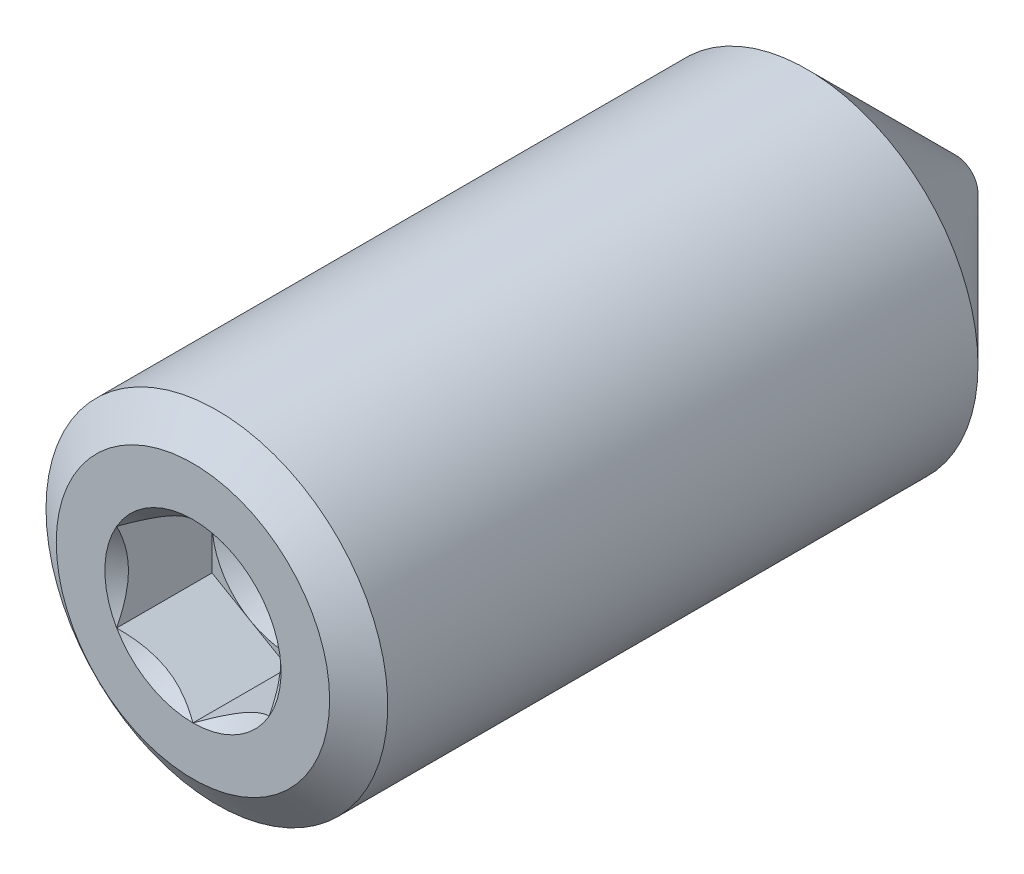
ISO-10303-21;
HEADER;
FILE_DESCRIPTION(('STEP AP214'),'2;1');
FILE_NAME('part.step','',(''),(''),'','','');
FILE_SCHEMA(('AUTOMOTIVE_DESIGN { 1 0 10303 214 1 1 1 1 }'));
ENDSEC;
DATA;
#1=APPLICATION_CONTEXT('core data for automotive mechanical design processes');
#2=APPLICATION_PROTOCOL_DEFINITION('international standard','automotive_design',2000,#1);
#3=PRODUCT_CONTEXT('',#1,'mechanical');
#4=PRODUCT('Part','Part','',(#3));
#5=PRODUCT_RELATED_PRODUCT_CATEGORY('part','',(#4));
#6=PRODUCT_DEFINITION_FORMATION('','',#4);
#7=PRODUCT_DEFINITION_CONTEXT('part definition',#1,'design');
#8=PRODUCT_DEFINITION('design','',#6,#7);
#9=PRODUCT_DEFINITION_SHAPE('','',#8);
#10=(LENGTH_UNIT() NAMED_UNIT(*) SI_UNIT(.MILLI.,.METRE.));
#11=(NAMED_UNIT(*) PLANE_ANGLE_UNIT() SI_UNIT($,.RADIAN.));
#12=(NAMED_UNIT(*) SI_UNIT($,.STERADIAN.) SOLID_ANGLE_UNIT());
#13=UNCERTAINTY_MEASURE_WITH_UNIT(LENGTH_MEASURE(1.E-05),#10,'distance_accuracy_value','');
#14=(GEOMETRIC_REPRESENTATION_CONTEXT(3) GLOBAL_UNCERTAINTY_ASSIGNED_CONTEXT((#13)) GLOBAL_UNIT_ASSIGNED_CONTEXT((#10,
#11,#12)) REPRESENTATION_CONTEXT('',''));
#15=CARTESIAN_POINT('',(0.,0.,0.));
#16=DIRECTION('',(0.,0.,1.));
#17=DIRECTION('',(1.,0.,0.));
#18=AXIS2_PLACEMENT_3D('',#15,#16,#17);
#19=CARTESIAN_POINT('',(0.,0.733234841870825,2.38125));
#20=DIRECTION('',(0.,0.,1.));
#21=DIRECTION('',(1.,0.,0.));
#22=AXIS2_PLACEMENT_3D('',#19,#20,#21);
#23=PLANE('',#22);
#24=CARTESIAN_POINT('',(0.,0.,2.38125));
#25=DIRECTION('',(0.,0.,1.));
#26=DIRECTION('',(1.,0.,0.));
#27=AXIS2_PLACEMENT_3D('',#24,#25,#26);
#28=CIRCLE('',#27,0.635);
#29=CARTESIAN_POINT('',(0.635,0.,2.38125));
#30=VERTEX_POINT('',#29);
#31=CARTESIAN_POINT('',(0.3175,0.549926131403119,2.38125));
#32=VERTEX_POINT('',#31);
#33=EDGE_CURVE('E135',#30,#32,#28,.T.);
#34=ORIENTED_EDGE('',*,*,#33,.F.);
#35=DIRECTION('',(0.,1.,0.));
#36=VECTOR('',#35,1.);
#37=CARTESIAN_POINT('',(0.635,-0.366617420935413,2.38125));
#38=LINE('',#37,#36);
#39=CARTESIAN_POINT('',(0.635,0.366617420935412,2.38125));
#40=VERTEX_POINT('',#39);
#41=EDGE_CURVE('E165',#30,#40,#38,.T.);
#42=ORIENTED_EDGE('',*,*,#41,.T.);
#43=DIRECTION('',(-0.866025403784439,0.5,0.));
#44=VECTOR('',#43,1.);
#45=CARTESIAN_POINT('',(0.635,0.366617420935412,2.38125));
#46=LINE('',#45,#44);
#47=EDGE_CURVE('E154',#40,#32,#46,.T.);
#48=ORIENTED_EDGE('',*,*,#47,.T.);
#49=EDGE_LOOP('',(#34,#42,#48));
#50=FACE_BOUND('',#49,.T.);
#51=ADVANCED_FACE('F50',(#50),#23,.T.);
#52=CARTESIAN_POINT('',(-0.3175,0.549926131403119,2.38125));
#53=VERTEX_POINT('',#52);
#54=EDGE_CURVE('E134',#32,#53,#28,.T.);
#55=ORIENTED_EDGE('',*,*,#54,.F.);
#56=CARTESIAN_POINT('',(0.,0.733234841870825,2.38125));
#57=VERTEX_POINT('',#56);
#58=EDGE_CURVE('E148',#32,#57,#46,.T.);
#59=ORIENTED_EDGE('',*,*,#58,.T.);
#60=DIRECTION('',(-0.866025403784439,-0.5,0.));
#61=VECTOR('',#60,1.);
#62=CARTESIAN_POINT('',(0.,0.733234841870825,2.38125));
#63=LINE('',#62,#61);
#64=EDGE_CURVE('E149',#57,#53,#63,.T.);
#65=ORIENTED_EDGE('',*,*,#64,.T.);
#66=EDGE_LOOP('',(#55,#59,#65));
#67=FACE_BOUND('',#66,.T.);
#68=ADVANCED_FACE('F144',(#67),#23,.T.);
#69=CARTESIAN_POINT('',(-0.635,0.,2.38125));
#70=VERTEX_POINT('',#69);
#71=EDGE_CURVE('E151',#53,#70,#28,.T.);
#72=ORIENTED_EDGE('',*,*,#71,.F.);
#73=CARTESIAN_POINT('',(-0.635,0.366617420935412,2.38125));
#74=VERTEX_POINT('',#73);
#75=EDGE_CURVE('E164',#53,#74,#63,.T.);
#76=ORIENTED_EDGE('',*,*,#75,.T.);
#77=DIRECTION('',(0.,-1.,0.));
#78=VECTOR('',#77,1.);
#79=CARTESIAN_POINT('',(-0.635,0.366617420935412,2.38125));
#80=LINE('',#79,#78);
#81=EDGE_CURVE('E179',#74,#70,#80,.T.);
#82=ORIENTED_EDGE('',*,*,#81,.T.);
#83=EDGE_LOOP('',(#72,#76,#82));
#84=FACE_BOUND('',#83,.T.);
#85=ADVANCED_FACE('F253',(#84),#23,.T.);
#86=CARTESIAN_POINT('',(-0.3175,-0.549926131403119,2.38125));
#87=VERTEX_POINT('',#86);
#88=EDGE_CURVE('E277',#70,#87,#28,.T.);
#89=ORIENTED_EDGE('',*,*,#88,.F.);
#90=CARTESIAN_POINT('',(-0.635,-0.366617420935412,2.38125));
#91=VERTEX_POINT('',#90);
#92=EDGE_CURVE('E177',#70,#91,#80,.T.);
#93=ORIENTED_EDGE('',*,*,#92,.T.);
#94=DIRECTION('',(0.866025403784439,-0.5,0.));
#95=VECTOR('',#94,1.);
#96=CARTESIAN_POINT('',(-0.635,-0.366617420935412,2.38125));
#97=LINE('',#96,#95);
#98=EDGE_CURVE('E181',#91,#87,#97,.T.);
#99=ORIENTED_EDGE('',*,*,#98,.T.);
#100=EDGE_LOOP('',(#89,#93,#99));
#101=FACE_BOUND('',#100,.T.);
#102=ADVANCED_FACE('F266',(#101),#23,.T.);
#103=CARTESIAN_POINT('',(0.3175,-0.549926131403119,2.38125));
#104=VERTEX_POINT('',#103);
#105=EDGE_CURVE('E68',#87,#104,#28,.T.);
#106=ORIENTED_EDGE('',*,*,#105,.F.);
#107=CARTESIAN_POINT('',(0.,-0.733234841870825,2.38125));
#108=VERTEX_POINT('',#107);
#109=EDGE_CURVE('E185',#87,#108,#97,.T.);
#110=ORIENTED_EDGE('',*,*,#109,.T.);
#111=DIRECTION('',(0.866025403784439,0.5,0.));
#112=VECTOR('',#111,1.);
#113=CARTESIAN_POINT('',(0.,-0.733234841870825,2.38125));
#114=LINE('',#113,#112);
#115=EDGE_CURVE('E186',#108,#104,#114,.T.);
#116=ORIENTED_EDGE('',*,*,#115,.T.);
#117=EDGE_LOOP('',(#106,#110,#116));
#118=FACE_BOUND('',#117,.T.);
#119=ADVANCED_FACE('F241',(#118),#23,.T.);
#120=CARTESIAN_POINT('',(0.,0.184912,-3.175));
#121=DIRECTION('',(0.,0.,-1.));
#122=DIRECTION('',(-1.,0.,0.));
#123=AXIS2_PLACEMENT_3D('',#120,#121,#122);
#124=PLANE('',#123);
#125=CARTESIAN_POINT('',(0.,0.,-3.175));
#126=DIRECTION('',(0.,0.,-1.));
#127=DIRECTION('',(-1.,0.,0.));
#128=AXIS2_PLACEMENT_3D('',#125,#126,#127);
#129=CIRCLE('',#128,0.184912000000001);
#130=CARTESIAN_POINT('',(0.184912000000001,0.,-3.175));
#131=VERTEX_POINT('',#130);
#132=EDGE_CURVE('E65',#131,#131,#129,.T.);
#133=ORIENTED_EDGE('',*,*,#132,.T.);
#134=EDGE_LOOP('',(#133));
#135=FACE_BOUND('',#134,.T.);
#136=ADVANCED_FACE('F47',(#135),#124,.T.);
#137=CARTESIAN_POINT('',(0.,0.,-3.175));
#138=DIRECTION('',(0.,0.,1.));
#139=DIRECTION('',(1.,0.,0.));
#140=AXIS2_PLACEMENT_3D('',#137,#138,#139);
#141=CONICAL_SURFACE('',#140,0.184912000000001,0.785398163397447);
#142=CARTESIAN_POINT('',(0.,0.,-1.937512));
#143=DIRECTION('',(0.,0.,-1.));
#144=DIRECTION('',(-1.,0.,0.));
#145=AXIS2_PLACEMENT_3D('',#142,#143,#144);
#146=CIRCLE('',#145,1.4224);
#147=CARTESIAN_POINT('',(1.4224,0.,-1.937512));
#148=VERTEX_POINT('',#147);
#149=EDGE_CURVE('E221',#148,#148,#146,.T.);
#150=CARTESIAN_POINT('',(1.4224,0.,-1.937512));
#151=CARTESIAN_POINT('',(1.4095095,0.,-1.9504025));
#152=CARTESIAN_POINT('',(1.396619,0.,-1.963293));
#153=CARTESIAN_POINT('',(1.370838,0.,-1.989074));
#154=CARTESIAN_POINT('',(1.3579475,0.,-2.0019645));
#155=CARTESIAN_POINT('',(1.3321665,0.,-2.0277455));
#156=CARTESIAN_POINT('',(1.319276,0.,-2.040636));
#157=CARTESIAN_POINT('',(1.293495,0.,-2.066417));
#158=CARTESIAN_POINT('',(1.2806045,0.,-2.0793075));
#159=CARTESIAN_POINT('',(1.2548235,0.,-2.1050885));
#160=CARTESIAN_POINT('',(1.241933,0.,-2.117979));
#161=CARTESIAN_POINT('',(1.216152,0.,-2.14376));
#162=CARTESIAN_POINT('',(1.2032615,0.,-2.1566505));
#163=CARTESIAN_POINT('',(1.1774805,0.,-2.1824315));
#164=CARTESIAN_POINT('',(1.16459,0.,-2.195322));
#165=CARTESIAN_POINT('',(1.138809,0.,-2.221103));
#166=CARTESIAN_POINT('',(1.1259185,0.,-2.2339935));
#167=CARTESIAN_POINT('',(1.1001375,0.,-2.2597745));
#168=CARTESIAN_POINT('',(1.087247,0.,-2.272665));
#169=CARTESIAN_POINT('',(1.061466,0.,-2.298446));
#170=CARTESIAN_POINT('',(1.0485755,0.,-2.3113365));
#171=CARTESIAN_POINT('',(1.0227945,0.,-2.3371175));
#172=CARTESIAN_POINT('',(1.009904,0.,-2.350008));
#173=CARTESIAN_POINT('',(0.984123000000001,0.,-2.375789));
#174=CARTESIAN_POINT('',(0.971232500000001,0.,-2.3886795));
#175=CARTESIAN_POINT('',(0.945451500000001,0.,-2.4144605));
#176=CARTESIAN_POINT('',(0.932561000000001,0.,-2.427351));
#177=CARTESIAN_POINT('',(0.906780000000001,0.,-2.453132));
#178=CARTESIAN_POINT('',(0.893889500000001,0.,-2.4660225));
#179=CARTESIAN_POINT('',(0.868108500000001,0.,-2.4918035));
#180=CARTESIAN_POINT('',(0.855218000000001,0.,-2.504694));
#181=CARTESIAN_POINT('',(0.829437000000001,0.,-2.530475));
#182=CARTESIAN_POINT('',(0.816546500000001,0.,-2.5433655));
#183=CARTESIAN_POINT('',(0.790765500000001,0.,-2.5691465));
#184=CARTESIAN_POINT('',(0.777875000000001,0.,-2.582037));
#185=CARTESIAN_POINT('',(0.752094000000001,0.,-2.607818));
#186=CARTESIAN_POINT('',(0.739203500000001,0.,-2.6207085));
#187=CARTESIAN_POINT('',(0.713422500000001,0.,-2.6464895));
#188=CARTESIAN_POINT('',(0.700532000000001,0.,-2.65938));
#189=CARTESIAN_POINT('',(0.674751000000001,0.,-2.685161));
#190=CARTESIAN_POINT('',(0.661860500000001,0.,-2.6980515));
#191=CARTESIAN_POINT('',(0.636079500000001,0.,-2.7238325));
#192=CARTESIAN_POINT('',(0.623189000000001,0.,-2.736723));
#193=CARTESIAN_POINT('',(0.597408000000001,0.,-2.762504));
#194=CARTESIAN_POINT('',(0.584517500000001,0.,-2.7753945));
#195=CARTESIAN_POINT('',(0.558736500000001,0.,-2.8011755));
#196=CARTESIAN_POINT('',(0.545846000000001,0.,-2.814066));
#197=CARTESIAN_POINT('',(0.520065000000001,0.,-2.839847));
#198=CARTESIAN_POINT('',(0.507174500000001,0.,-2.8527375));
#199=CARTESIAN_POINT('',(0.481393500000001,0.,-2.8785185));
#200=CARTESIAN_POINT('',(0.468503000000001,0.,-2.891409));
#201=CARTESIAN_POINT('',(0.442722000000001,0.,-2.91719));
#202=CARTESIAN_POINT('',(0.429831500000001,0.,-2.9300805));
#203=CARTESIAN_POINT('',(0.404050500000001,0.,-2.9558615));
#204=CARTESIAN_POINT('',(0.391160000000001,0.,-2.968752));
#205=CARTESIAN_POINT('',(0.365379000000001,0.,-2.994533));
#206=CARTESIAN_POINT('',(0.352488500000001,0.,-3.0074235));
#207=CARTESIAN_POINT('',(0.326707500000001,0.,-3.0332045));
#208=CARTESIAN_POINT('',(0.313817000000001,0.,-3.046095));
#209=CARTESIAN_POINT('',(0.288036000000001,0.,-3.071876));
#210=CARTESIAN_POINT('',(0.275145500000001,0.,-3.0847665));
#211=CARTESIAN_POINT('',(0.249364500000001,0.,-3.1105475));
#212=CARTESIAN_POINT('',(0.236474000000001,0.,-3.123438));
#213=CARTESIAN_POINT('',(0.210693000000001,0.,-3.149219));
#214=CARTESIAN_POINT('',(0.197802500000001,0.,-3.1621095));
#215=CARTESIAN_POINT('',(0.184912000000001,0.,-3.175));
#216=B_SPLINE_CURVE_WITH_KNOTS('',3,(#150,#151,#152,#153,#154,#155,#156,#157,#158,#159,#160,
#161,#162,#163,#164,#165,#166,#167,#168,#169,#170,#171,#172,#173,#174,#175,#176,#177,#178,#179,
#180,#181,#182,#183,#184,#185,#186,#187,#188,#189,#190,#191,#192,#193,#194,#195,#196,#197,#198,
#199,#200,#201,#202,#203,#204,#205,#206,#207,#208,#209,#210,#211,#212,#213,#214,#215),
.UNSPECIFIED.,.F.,.F.,(4,2,2,2,2,2,2,2,2,2,2,2,2,2,2,2,2,2,2,2,2,2,2,2,2,2,2,2,2,2,2,2,4),(0.,
0.0546897597773112,0.109379519554623,0.164069279331934,0.218759039109245,0.273448798886556,
0.328138558663867,0.382828318441179,0.43751807821849,0.492207837995801,0.546897597773112,
0.601587357550423,0.656277117327735,0.710966877105046,0.765656636882358,0.820346396659668,
0.87503615643698,0.929725916214291,0.984415675991602,1.03910543576891,1.09379519554622,
1.14848495532354,1.20317471510085,1.25786447487816,1.31255423465547,1.36724399443278,
1.42193375421009,1.4766235139874,1.53131327376471,1.58600303354203,1.64069279331934,
1.69538255309665,1.75007231287396),.UNSPECIFIED.);
#217=EDGE_CURVE('BSEAM232',#148,#131,#216,.T.);
#218=ORIENTED_EDGE('',*,*,#149,.T.);
#219=ORIENTED_EDGE('',*,*,#132,.F.);
#220=ORIENTED_EDGE('',*,*,#217,.T.);
#221=ORIENTED_EDGE('',*,*,#217,.F.);
#222=EDGE_LOOP('',(#218,#220,#219,#221));
#223=FACE_BOUND('',#222,.T.);
#224=ADVANCED_FACE('F232',(#223),#141,.T.);
#225=CARTESIAN_POINT('',(0.,0.,-3.175));
#226=DIRECTION('',(0.,0.,-1.));
#227=DIRECTION('',(-1.,0.,0.));
#228=AXIS2_PLACEMENT_3D('',#225,#226,#227);
#229=CYLINDRICAL_SURFACE('',#228,1.4224);
#230=CARTESIAN_POINT('',(0.,0.,2.9758049595301));
#231=DIRECTION('',(0.,0.,-1.));
#232=DIRECTION('',(-1.,0.,0.));
#233=AXIS2_PLACEMENT_3D('',#230,#231,#232);
#234=CIRCLE('',#233,1.4224);
#235=CARTESIAN_POINT('',(-1.4224,0.,2.9758049595301));
#236=VERTEX_POINT('',#235);
#237=EDGE_CURVE('E219',#236,#236,#234,.T.);
#238=ORIENTED_EDGE('',*,*,#237,.T.);
#239=EDGE_LOOP('',(#238));
#240=FACE_BOUND('',#239,.T.);
#241=ORIENTED_EDGE('',*,*,#149,.F.);
#242=EDGE_LOOP('',(#241));
#243=FACE_BOUND('',#242,.T.);
#244=ADVANCED_FACE('F233',(#240,#243),#229,.T.);
#245=CARTESIAN_POINT('',(0.,0.,2.9758049595301));
#246=DIRECTION('',(0.,0.,-1.));
#247=DIRECTION('',(-1.,0.,0.));
#248=AXIS2_PLACEMENT_3D('',#245,#246,#247);
#249=CONICAL_SURFACE('',#248,1.4224,0.95993108859688);
#250=CARTESIAN_POINT('',(0.,0.,3.175));
#251=DIRECTION('',(0.,0.,-1.));
#252=DIRECTION('',(-1.,0.,0.));
#253=AXIS2_PLACEMENT_3D('',#250,#251,#252);
#254=CIRCLE('',#253,1.13792);
#255=CARTESIAN_POINT('',(-1.13792,0.,3.175));
#256=VERTEX_POINT('',#255);
#257=EDGE_CURVE('E200',#256,#256,#254,.T.);
#258=ORIENTED_EDGE('',*,*,#257,.T.);
#259=EDGE_LOOP('',(#258));
#260=FACE_BOUND('',#259,.T.);
#261=ORIENTED_EDGE('',*,*,#237,.F.);
#262=EDGE_LOOP('',(#261));
#263=FACE_BOUND('',#262,.T.);
#264=ADVANCED_FACE('F238',(#260,#263),#249,.T.);
#265=CARTESIAN_POINT('',(0.,0.,3.175));
#266=DIRECTION('',(0.,0.,1.));
#267=DIRECTION('',(1.,0.,0.));
#268=AXIS2_PLACEMENT_3D('',#265,#266,#267);
#269=PLANE('',#268);
#270=CARTESIAN_POINT('',(0.,0.,3.175));
#271=DIRECTION('',(0.,0.,1.));
#272=DIRECTION('',(1.,0.,0.));
#273=AXIS2_PLACEMENT_3D('',#270,#271,#272);
#274=CIRCLE('',#273,0.733234841870825);
#275=CARTESIAN_POINT('',(0.635,0.366617420935411,3.175));
#276=VERTEX_POINT('',#275);
#277=CARTESIAN_POINT('',(0.,0.733234841870823,3.175));
#278=VERTEX_POINT('',#277);
#279=EDGE_CURVE('E313',#276,#278,#274,.T.);
#280=ORIENTED_EDGE('',*,*,#279,.F.);
#281=CARTESIAN_POINT('',(0.635,-0.366617420935413,3.175));
#282=VERTEX_POINT('',#281);
#283=EDGE_CURVE('E78',#282,#276,#274,.T.);
#284=ORIENTED_EDGE('',*,*,#283,.F.);
#285=CARTESIAN_POINT('',(0.,-0.733234841870826,3.175));
#286=VERTEX_POINT('',#285);
#287=EDGE_CURVE('E304',#286,#282,#274,.T.);
#288=ORIENTED_EDGE('',*,*,#287,.F.);
#289=CARTESIAN_POINT('',(-0.635,-0.366617420935414,3.175));
#290=VERTEX_POINT('',#289);
#291=EDGE_CURVE('E298',#290,#286,#274,.T.);
#292=ORIENTED_EDGE('',*,*,#291,.F.);
#293=CARTESIAN_POINT('',(-0.634999999999998,0.366617420935414,3.175));
#294=VERTEX_POINT('',#293);
#295=EDGE_CURVE('E301',#294,#290,#274,.T.);
#296=ORIENTED_EDGE('',*,*,#295,.F.);
#297=EDGE_CURVE('E309',#278,#294,#274,.T.);
#298=ORIENTED_EDGE('',*,*,#297,.F.);
#299=EDGE_LOOP('',(#280,#284,#288,#292,#296,#298));
#300=FACE_BOUND('',#299,.T.);
#301=ORIENTED_EDGE('',*,*,#257,.F.);
#302=EDGE_LOOP('',(#301));
#303=FACE_BOUND('',#302,.T.);
#304=ADVANCED_FACE('F296',(#300,#303),#269,.T.);
#305=CARTESIAN_POINT('',(0.,0.,3.175));
#306=DIRECTION('',(0.,0.,1.));
#307=DIRECTION('',(1.,0.,0.));
#308=AXIS2_PLACEMENT_3D('',#305,#306,#307);
#309=CONICAL_SURFACE('',#308,0.733234841870825,0.78539816339745);
#310=ORIENTED_EDGE('',*,*,#297,.T.);
#311=CARTESIAN_POINT('',(0.000200000000000052,0.733350311924663,3.17511549732594));
#312=CARTESIAN_POINT('',(-0.0216382953156779,0.720741966245513,3.16251471523145));
#313=CARTESIAN_POINT('',(-0.0438403745570412,0.707923589818943,3.15065242075505));
#314=CARTESIAN_POINT('',(-0.0891134104790394,0.681785190342346,3.12893202089685));
#315=CARTESIAN_POINT('',(-0.112188680945241,0.668462676727061,3.11908601315109));
#316=CARTESIAN_POINT('',(-0.158721911288256,0.641596703662258,3.10222150279478));
#317=CARTESIAN_POINT('',(-0.182167952487112,0.628060125464668,3.09516053144257));
#318=CARTESIAN_POINT('',(-0.229565059822435,0.600695392785809,3.08427263650265));
#319=CARTESIAN_POINT('',(-0.253514703467399,0.586868059580394,3.08043760314623));
#320=CARTESIAN_POINT('',(-0.312013188787161,0.553093943333844,3.07557213495313));
#321=CARTESIAN_POINT('',(-0.346698667719925,0.533068272735041,3.07645233088706));
#322=CARTESIAN_POINT('',(-0.415342587019973,0.493436687448928,3.08552206408745));
#323=CARTESIAN_POINT('',(-0.449299864102859,0.473831444384177,3.09372251663846));
#324=CARTESIAN_POINT('',(-0.508936458936856,0.439400240303216,3.11349854218865));
#325=CARTESIAN_POINT('',(-0.534889912662095,0.424416006808549,3.12404263333793));
#326=CARTESIAN_POINT('',(-0.585779870462627,0.395034675973363,3.14779604870667));
#327=CARTESIAN_POINT('',(-0.610719373212327,0.380635847347368,3.16099670343896));
#328=CARTESIAN_POINT('',(-0.6352,0.366501950881575,3.17511549732593));
#329=B_SPLINE_CURVE_WITH_KNOTS('',3,(#311,#312,#313,#314,#315,#316,#317,#318,#319,#320,#321,
#322,#323,#324,#325,#326,#327,#328),.UNSPECIFIED.,.F.,.F.,(4,2,2,2,2,2,2,2,4),(0.,
0.08462591240832,0.169745589939071,0.253511844988299,0.337066883146093,0.456489711576423,
0.576090910203464,0.67126344829922,0.766130293046681),.UNSPECIFIED.);
#330=EDGE_CURVE('E11',#278,#294,#329,.T.);
#331=ORIENTED_EDGE('',*,*,#330,.F.);
#332=EDGE_LOOP('',(#310,#331));
#333=FACE_BOUND('',#332,.T.);
#334=ADVANCED_FACE('F264',(#333),#309,.F.);
#335=ORIENTED_EDGE('',*,*,#295,.T.);
#336=CARTESIAN_POINT('',(-0.635,-0.731184774905029,3.4101949052213));
#337=CARTESIAN_POINT('',(-0.635,-0.695560510635464,3.38335843318131));
#338=CARTESIAN_POINT('',(-0.635,-0.659559494542427,3.35696676788828));
#339=CARTESIAN_POINT('',(-0.635,-0.586184309988528,3.30554559409201));
#340=CARTESIAN_POINT('',(-0.635,-0.548801623395416,3.28052831137227));
#341=CARTESIAN_POINT('',(-0.635,-0.470413352958486,3.23140509006025));
#342=CARTESIAN_POINT('',(-0.635,-0.429322770893478,3.20743267599417));
#343=CARTESIAN_POINT('',(-0.635,-0.345090964349351,3.1635843213979));
#344=CARTESIAN_POINT('',(-0.635,-0.301957281434776,3.14369457081665));
#345=CARTESIAN_POINT('',(-0.635,-0.237206748479471,3.11936298918661));
#346=CARTESIAN_POINT('',(-0.635,-0.21655194944119,3.11237994139745));
#347=CARTESIAN_POINT('',(-0.635,-0.174754779429724,3.10006758646518));
#348=CARTESIAN_POINT('',(-0.635,-0.153612374975028,3.09473839324967));
#349=CARTESIAN_POINT('',(-0.635,-0.0903392283049224,3.08186090149537));
#350=CARTESIAN_POINT('',(-0.635,-0.0475748058684269,3.07710601608245));
#351=CARTESIAN_POINT('',(-0.635,0.0364716243291497,3.07647192409468));
#352=CARTESIAN_POINT('',(-0.635,0.0777512970673109,3.08027786995089));
#353=CARTESIAN_POINT('',(-0.635,0.138948326892627,3.0914655796225));
#354=CARTESIAN_POINT('',(-0.635,0.159409283049328,3.09617653583127));
#355=CARTESIAN_POINT('',(-0.635,0.199893323210748,3.10720163610963));
#356=CARTESIAN_POINT('',(-0.635,0.219916443701739,3.11351564603429));
#357=CARTESIAN_POINT('',(-0.635,0.282954568585313,3.1357707669286));
#358=CARTESIAN_POINT('',(-0.635,0.325069402101009,3.15424746255418));
#359=CARTESIAN_POINT('',(-0.635,0.407322059089849,3.1953310215375));
#360=CARTESIAN_POINT('',(-0.635,0.44745209988775,3.21795272349414));
#361=CARTESIAN_POINT('',(-0.635,0.524147789401849,3.26460987110921));
#362=CARTESIAN_POINT('',(-0.635,0.560791466616128,3.28851920217037));
#363=CARTESIAN_POINT('',(-0.635,0.632664852451175,3.33777829933762));
#364=CARTESIAN_POINT('',(-0.635,0.667903672431243,3.36311468957093));
#365=CARTESIAN_POINT('',(-0.635,0.70275567694919,3.38891379561134));
#366=B_SPLINE_CURVE_WITH_KNOTS('',3,(#336,#337,#338,#339,#340,#341,#342,#343,#344,#345,#346,
#347,#348,#349,#350,#351,#352,#353,#354,#355,#356,#357,#358,#359,#360,#361,#362,#363,#364,#365),
.UNSPECIFIED.,.F.,.F.,(4,2,2,2,2,2,2,2,2,2,2,2,2,2,4),(0.,0.133852167778589,0.268748027168032,
0.411343582300858,0.553448541187974,0.618797785929159,0.684151531326684,0.812345657019683,
0.935902476279364,0.998834470169286,1.06176119958963,1.19932956824188,1.33740039345849,
1.46861008284853,1.59874695816139),.UNSPECIFIED.);
#367=EDGE_CURVE('E288',#294,#290,#366,.F.);
#368=ORIENTED_EDGE('',*,*,#367,.F.);
#369=EDGE_LOOP('',(#335,#368));
#370=FACE_BOUND('',#369,.T.);
#371=ADVANCED_FACE('F363',(#370),#309,.F.);
#372=ORIENTED_EDGE('',*,*,#291,.T.);
#373=CARTESIAN_POINT('',(-0.6352,-0.366501950881574,3.17511549732593));
#374=CARTESIAN_POINT('',(-0.613361704684322,-0.379110296560724,3.16251471523145));
#375=CARTESIAN_POINT('',(-0.591159625442959,-0.391928672987294,3.15065242075504));
#376=CARTESIAN_POINT('',(-0.545886589520961,-0.418067072463891,3.12893202089685));
#377=CARTESIAN_POINT('',(-0.522811319054759,-0.431389586079176,3.11908601315109));
#378=CARTESIAN_POINT('',(-0.476278088711744,-0.458255559143979,3.10222150279478));
#379=CARTESIAN_POINT('',(-0.452832047512888,-0.471792137341569,3.09516053144256));
#380=CARTESIAN_POINT('',(-0.405434940177565,-0.499156870020428,3.08427263650265));
#381=CARTESIAN_POINT('',(-0.381485296532602,-0.512984203225843,3.08043760314623));
#382=CARTESIAN_POINT('',(-0.322986811212839,-0.546758319472393,3.07557213495313));
#383=CARTESIAN_POINT('',(-0.288301332280075,-0.566783990071196,3.07645233088706));
#384=CARTESIAN_POINT('',(-0.219657412980028,-0.606415575357309,3.08552206408745));
#385=CARTESIAN_POINT('',(-0.185700135897143,-0.626020818422059,3.09372251663846));
#386=CARTESIAN_POINT('',(-0.126063541063145,-0.660452022503021,3.11349854218865));
#387=CARTESIAN_POINT('',(-0.100110087337906,-0.675436255997688,3.12404263333793));
#388=CARTESIAN_POINT('',(-0.0492201295373732,-0.704817586832874,3.14779604870667));
#389=CARTESIAN_POINT('',(-0.0242806267876735,-0.719216415458869,3.16099670343896));
#390=CARTESIAN_POINT('',(0.000199999999999972,-0.733350311924663,3.17511549732593));
#391=B_SPLINE_CURVE_WITH_KNOTS('',3,(#373,#374,#375,#376,#377,#378,#379,#380,#381,#382,#383,
#384,#385,#386,#387,#388,#389,#390),.UNSPECIFIED.,.F.,.F.,(4,2,2,2,2,2,2,2,4),(0.,
0.0846259124083198,0.169745589939071,0.253511844988299,0.337066883146092,0.456489711576422,
0.576090910203462,0.671263448299218,0.766130293046681),.UNSPECIFIED.);
#392=EDGE_CURVE('E295',#290,#286,#391,.T.);
#393=ORIENTED_EDGE('',*,*,#392,.F.);
#394=EDGE_LOOP('',(#372,#393));
#395=FACE_BOUND('',#394,.T.);
#396=ADVANCED_FACE('F369',(#395),#309,.F.);
#397=ORIENTED_EDGE('',*,*,#287,.T.);
#398=CARTESIAN_POINT('',(-0.000200000000000071,-0.733350311924663,3.17511549732593));
#399=CARTESIAN_POINT('',(0.0216382953156777,-0.720741966245514,3.16251471523145));
#400=CARTESIAN_POINT('',(0.0438403745570411,-0.707923589818943,3.15065242075504));
#401=CARTESIAN_POINT('',(0.0891134104790393,-0.681785190342346,3.12893202089685));
#402=CARTESIAN_POINT('',(0.112188680945241,-0.668462676727061,3.11908601315109));
#403=CARTESIAN_POINT('',(0.158721911288256,-0.641596703662259,3.10222150279478));
#404=CARTESIAN_POINT('',(0.182167952487112,-0.628060125464668,3.09516053144256));
#405=CARTESIAN_POINT('',(0.229565059822434,-0.60069539278581,3.08427263650265));
#406=CARTESIAN_POINT('',(0.253514703467398,-0.586868059580395,3.08043760314623));
#407=CARTESIAN_POINT('',(0.31201318878716,-0.553093943333845,3.07557213495313));
#408=CARTESIAN_POINT('',(0.346698667719924,-0.533068272735042,3.07645233088706));
#409=CARTESIAN_POINT('',(0.415342587019972,-0.493436687448929,3.08552206408745));
#410=CARTESIAN_POINT('',(0.449299864102857,-0.473831444384178,3.09372251663846));
#411=CARTESIAN_POINT('',(0.508936458936855,-0.439400240303217,3.11349854218865));
#412=CARTESIAN_POINT('',(0.534889912662094,-0.42441600680855,3.12404263333793));
#413=CARTESIAN_POINT('',(0.585779870462627,-0.395034675973364,3.14779604870667));
#414=CARTESIAN_POINT('',(0.610719373212327,-0.380635847347369,3.16099670343896));
#415=CARTESIAN_POINT('',(0.6352,-0.366501950881575,3.17511549732593));
#416=B_SPLINE_CURVE_WITH_KNOTS('',3,(#398,#399,#400,#401,#402,#403,#404,#405,#406,#407,#408,
#409,#410,#411,#412,#413,#414,#415),.UNSPECIFIED.,.F.,.F.,(4,2,2,2,2,2,2,2,4),(0.,
0.08462591240832,0.169745589939071,0.253511844988299,0.337066883146092,0.456489711576422,
0.576090910203462,0.671263448299218,0.766130293046681),.UNSPECIFIED.);
#417=EDGE_CURVE('E482',#286,#282,#416,.T.);
#418=ORIENTED_EDGE('',*,*,#417,.F.);
#419=EDGE_LOOP('',(#397,#418));
#420=FACE_BOUND('',#419,.T.);
#421=ADVANCED_FACE('F380',(#420),#309,.F.);
#422=ORIENTED_EDGE('',*,*,#283,.T.);
#423=CARTESIAN_POINT('',(0.635,-0.731184775011414,3.41019490530162));
#424=CARTESIAN_POINT('',(0.635,-0.69556051073587,3.38335843325546));
#425=CARTESIAN_POINT('',(0.635,-0.659559494636831,3.35696676795625));
#426=CARTESIAN_POINT('',(0.635,-0.586184310070636,3.30554559414765));
#427=CARTESIAN_POINT('',(0.635,-0.548801623471228,3.28052831142175));
#428=CARTESIAN_POINT('',(0.635,-0.470413353020567,3.23140509009707));
#429=CARTESIAN_POINT('',(0.635,-0.429322770948089,3.20743267602453));
#430=CARTESIAN_POINT('',(0.635,-0.345090964388387,3.16358432141629));
#431=CARTESIAN_POINT('',(0.635,-0.301957281465712,3.14369457082952));
#432=CARTESIAN_POINT('',(0.635,-0.237206748504313,3.11936298919537));
#433=CARTESIAN_POINT('',(0.635,-0.216551949468585,3.11237994140638));
#434=CARTESIAN_POINT('',(0.635,-0.174754779462304,3.10006758647391));
#435=CARTESIAN_POINT('',(0.635,-0.15361237501024,3.09473839325805));
#436=CARTESIAN_POINT('',(0.635,-0.0903392283478526,3.08186090150177));
#437=CARTESIAN_POINT('',(0.635,-0.047574805916484,3.07710601608636));
#438=CARTESIAN_POINT('',(0.635,0.0364716242720106,3.0764719240917));
#439=CARTESIAN_POINT('',(0.635,0.0777512970061892,3.08027786994362));
#440=CARTESIAN_POINT('',(0.635,0.138948326826021,3.0914655796083));
#441=CARTESIAN_POINT('',(0.635,0.159409282980901,3.09617653581463));
#442=CARTESIAN_POINT('',(0.635,0.199893323138851,3.10720163608807));
#443=CARTESIAN_POINT('',(0.635,0.219916443628193,3.11351564601023));
#444=CARTESIAN_POINT('',(0.635,0.282954568495751,3.13577076689279));
#445=CARTESIAN_POINT('',(0.635,0.325069401997883,3.15424746250755));
#446=CARTESIAN_POINT('',(0.635,0.407322058960639,3.19533102146806));
#447=CARTESIAN_POINT('',(0.635,0.447452099746024,3.21795272341268));
#448=CARTESIAN_POINT('',(0.635,0.524147789237618,3.26460987100476));
#449=CARTESIAN_POINT('',(0.635,0.560791466441827,3.28851920205506));
#450=CARTESIAN_POINT('',(0.635,0.632664852257085,3.33777829920066));
#451=CARTESIAN_POINT('',(0.635,0.66790367222743,3.36311468942321));
#452=CARTESIAN_POINT('',(0.635,0.702755676735662,3.38891379545291));
#453=B_SPLINE_CURVE_WITH_KNOTS('',3,(#423,#424,#425,#426,#427,#428,#429,#430,#431,#432,#433,
#434,#435,#436,#437,#438,#439,#440,#441,#442,#443,#444,#445,#446,#447,#448,#449,#450,#451,#452),
.UNSPECIFIED.,.F.,.F.,(4,2,2,2,2,2,2,2,2,2,2,2,2,2,4),(0.,0.133852167804068,0.26874802721947,
0.411343582381407,0.553448541297358,0.618797786031163,0.684151531421321,0.812345657100249,
0.935902476347018,0.998834470229971,1.06176119964335,1.19932956824552,1.33740039341172,
1.46861008275864,1.59874695802895),.UNSPECIFIED.);
#454=EDGE_CURVE('E491',#282,#276,#453,.T.);
#455=ORIENTED_EDGE('',*,*,#454,.F.);
#456=EDGE_LOOP('',(#422,#455));
#457=FACE_BOUND('',#456,.T.);
#458=ADVANCED_FACE('F263',(#457),#309,.F.);
#459=ORIENTED_EDGE('',*,*,#279,.T.);
#460=CARTESIAN_POINT('',(0.6352,0.366501950881574,3.17511549732593));
#461=CARTESIAN_POINT('',(0.613361704684322,0.379110296560724,3.16251471523145));
#462=CARTESIAN_POINT('',(0.591159625442959,0.391928672987294,3.15065242075505));
#463=CARTESIAN_POINT('',(0.545886589520961,0.418067072463891,3.12893202089685));
#464=CARTESIAN_POINT('',(0.522811319054759,0.431389586079176,3.11908601315109));
#465=CARTESIAN_POINT('',(0.476278088711744,0.458255559143979,3.10222150279478));
#466=CARTESIAN_POINT('',(0.452832047512888,0.471792137341569,3.09516053144257));
#467=CARTESIAN_POINT('',(0.405434940177566,0.499156870020427,3.08427263650265));
#468=CARTESIAN_POINT('',(0.381485296532602,0.512984203225843,3.08043760314623));
#469=CARTESIAN_POINT('',(0.32298681121284,0.546758319472393,3.07557213495313));
#470=CARTESIAN_POINT('',(0.288301332280076,0.566783990071195,3.07645233088706));
#471=CARTESIAN_POINT('',(0.219657412980028,0.606415575357309,3.08552206408745));
#472=CARTESIAN_POINT('',(0.185700135897143,0.626020818422059,3.09372251663846));
#473=CARTESIAN_POINT('',(0.126063541063145,0.660452022503021,3.11349854218865));
#474=CARTESIAN_POINT('',(0.100110087337906,0.675436255997688,3.12404263333793));
#475=CARTESIAN_POINT('',(0.049220129537373,0.704817586832874,3.14779604870667));
#476=CARTESIAN_POINT('',(0.0242806267876735,0.719216415458869,3.16099670343896));
#477=CARTESIAN_POINT('',(-0.000199999999999972,0.733350311924663,3.17511549732594));
#478=B_SPLINE_CURVE_WITH_KNOTS('',3,(#460,#461,#462,#463,#464,#465,#466,#467,#468,#469,#470,
#471,#472,#473,#474,#475,#476,#477),.UNSPECIFIED.,.F.,.F.,(4,2,2,2,2,2,2,2,4),(0.,
0.0846259124083199,0.169745589939071,0.253511844988298,0.337066883146091,0.456489711576422,
0.576090910203462,0.671263448299219,0.766130293046681),.UNSPECIFIED.);
#479=EDGE_CURVE('E159',#276,#278,#478,.T.);
#480=ORIENTED_EDGE('',*,*,#479,.F.);
#481=EDGE_LOOP('',(#459,#480));
#482=FACE_BOUND('',#481,.T.);
#483=ADVANCED_FACE('F254',(#482),#309,.F.);
#484=EDGE_CURVE('E136',#104,#30,#28,.T.);
#485=ORIENTED_EDGE('',*,*,#484,.F.);
#486=CARTESIAN_POINT('',(0.635,-0.366617420935413,2.38125));
#487=VERTEX_POINT('',#486);
#488=EDGE_CURVE('E190',#104,#487,#114,.T.);
#489=ORIENTED_EDGE('',*,*,#488,.T.);
#490=EDGE_CURVE('E192',#487,#30,#38,.T.);
#491=ORIENTED_EDGE('',*,*,#490,.T.);
#492=EDGE_LOOP('',(#485,#489,#491));
#493=FACE_BOUND('',#492,.T.);
#494=ADVANCED_FACE('F246',(#493),#23,.T.);
#495=CARTESIAN_POINT('',(0.,0.733234841870825,2.38125));
#496=DIRECTION('',(-0.5,0.866025403784439,0.));
#497=DIRECTION('',(-0.866025403784439,-0.5,0.));
#498=AXIS2_PLACEMENT_3D('',#495,#496,#497);
#499=PLANE('',#498);
#500=DIRECTION('',(0.,0.,1.));
#501=VECTOR('',#500,1.);
#502=CARTESIAN_POINT('',(0.,0.733234841870825,2.38125));
#503=LINE('',#502,#501);
#504=EDGE_CURVE('E158',#57,#278,#503,.T.);
#505=ORIENTED_EDGE('',*,*,#504,.T.);
#506=ORIENTED_EDGE('',*,*,#330,.T.);
#507=DIRECTION('',(0.,0.,1.));
#508=VECTOR('',#507,1.);
#509=CARTESIAN_POINT('',(-0.635,0.366617420935412,2.38125));
#510=LINE('',#509,#508);
#511=EDGE_CURVE('E211',#74,#294,#510,.T.);
#512=ORIENTED_EDGE('',*,*,#511,.F.);
#513=ORIENTED_EDGE('',*,*,#75,.F.);
#514=ORIENTED_EDGE('',*,*,#64,.F.);
#515=EDGE_LOOP('',(#505,#506,#512,#513,#514));
#516=FACE_BOUND('',#515,.T.);
#517=ADVANCED_FACE('F255',(#516),#499,.F.);
#518=CARTESIAN_POINT('',(-0.635,0.366617420935412,2.38125));
#519=DIRECTION('',(-1.,0.,0.));
#520=DIRECTION('',(0.,-1.,0.));
#521=AXIS2_PLACEMENT_3D('',#518,#519,#520);
#522=PLANE('',#521);
#523=ORIENTED_EDGE('',*,*,#511,.T.);
#524=ORIENTED_EDGE('',*,*,#367,.T.);
#525=DIRECTION('',(0.,0.,1.));
#526=VECTOR('',#525,1.);
#527=CARTESIAN_POINT('',(-0.635,-0.366617420935412,2.38125));
#528=LINE('',#527,#526);
#529=EDGE_CURVE('E210',#91,#290,#528,.T.);
#530=ORIENTED_EDGE('',*,*,#529,.F.);
#531=ORIENTED_EDGE('',*,*,#92,.F.);
#532=ORIENTED_EDGE('',*,*,#81,.F.);
#533=EDGE_LOOP('',(#523,#524,#530,#531,#532));
#534=FACE_BOUND('',#533,.T.);
#535=ADVANCED_FACE('F261',(#534),#522,.F.);
#536=CARTESIAN_POINT('',(-0.635,-0.366617420935412,2.38125));
#537=DIRECTION('',(-0.5,-0.866025403784438,0.));
#538=DIRECTION('',(0.866025403784439,-0.5,0.));
#539=AXIS2_PLACEMENT_3D('',#536,#537,#538);
#540=PLANE('',#539);
#541=ORIENTED_EDGE('',*,*,#529,.T.);
#542=ORIENTED_EDGE('',*,*,#392,.T.);
#543=DIRECTION('',(0.,0.,1.));
#544=VECTOR('',#543,1.);
#545=CARTESIAN_POINT('',(0.,-0.733234841870825,2.38125));
#546=LINE('',#545,#544);
#547=EDGE_CURVE('E201',#108,#286,#546,.T.);
#548=ORIENTED_EDGE('',*,*,#547,.F.);
#549=ORIENTED_EDGE('',*,*,#109,.F.);
#550=ORIENTED_EDGE('',*,*,#98,.F.);
#551=EDGE_LOOP('',(#541,#542,#548,#549,#550));
#552=FACE_BOUND('',#551,.T.);
#553=ADVANCED_FACE('F276',(#552),#540,.F.);
#554=CARTESIAN_POINT('',(0.,-0.733234841870825,2.38125));
#555=DIRECTION('',(0.5,-0.866025403784439,0.));
#556=DIRECTION('',(0.866025403784439,0.5,0.));
#557=AXIS2_PLACEMENT_3D('',#554,#555,#556);
#558=PLANE('',#557);
#559=ORIENTED_EDGE('',*,*,#547,.T.);
#560=ORIENTED_EDGE('',*,*,#417,.T.);
#561=DIRECTION('',(0.,0.,1.));
#562=VECTOR('',#561,1.);
#563=CARTESIAN_POINT('',(0.635,-0.366617420935413,2.38125));
#564=LINE('',#563,#562);
#565=EDGE_CURVE('E199',#487,#282,#564,.T.);
#566=ORIENTED_EDGE('',*,*,#565,.F.);
#567=ORIENTED_EDGE('',*,*,#488,.F.);
#568=ORIENTED_EDGE('',*,*,#115,.F.);
#569=EDGE_LOOP('',(#559,#560,#566,#567,#568));
#570=FACE_BOUND('',#569,.T.);
#571=ADVANCED_FACE('F439',(#570),#558,.F.);
#572=CARTESIAN_POINT('',(0.635,-0.366617420935413,2.38125));
#573=DIRECTION('',(1.,0.,0.));
#574=DIRECTION('',(0.,1.,0.));
#575=AXIS2_PLACEMENT_3D('',#572,#573,#574);
#576=PLANE('',#575);
#577=ORIENTED_EDGE('',*,*,#565,.T.);
#578=ORIENTED_EDGE('',*,*,#454,.T.);
#579=DIRECTION('',(0.,0.,1.));
#580=VECTOR('',#579,1.);
#581=CARTESIAN_POINT('',(0.635,0.366617420935412,2.38125));
#582=LINE('',#581,#580);
#583=EDGE_CURVE('E198',#40,#276,#582,.T.);
#584=ORIENTED_EDGE('',*,*,#583,.F.);
#585=ORIENTED_EDGE('',*,*,#41,.F.);
#586=ORIENTED_EDGE('',*,*,#490,.F.);
#587=EDGE_LOOP('',(#577,#578,#584,#585,#586));
#588=FACE_BOUND('',#587,.T.);
#589=ADVANCED_FACE('F338',(#588),#576,.F.);
#590=CARTESIAN_POINT('',(0.635,0.366617420935412,2.38125));
#591=DIRECTION('',(0.5,0.866025403784439,0.));
#592=DIRECTION('',(-0.866025403784439,0.5,0.));
#593=AXIS2_PLACEMENT_3D('',#590,#591,#592);
#594=PLANE('',#593);
#595=ORIENTED_EDGE('',*,*,#583,.T.);
#596=ORIENTED_EDGE('',*,*,#479,.T.);
#597=ORIENTED_EDGE('',*,*,#504,.F.);
#598=ORIENTED_EDGE('',*,*,#58,.F.);
#599=ORIENTED_EDGE('',*,*,#47,.F.);
#600=EDGE_LOOP('',(#595,#596,#597,#598,#599));
#601=FACE_BOUND('',#600,.T.);
#602=ADVANCED_FACE('F129',(#601),#594,.F.);
#603=CARTESIAN_POINT('',(0.,0.,2.38125));
#604=DIRECTION('',(0.,0.,1.));
#605=DIRECTION('',(1.,0.,0.));
#606=AXIS2_PLACEMENT_3D('',#603,#604,#605);
#607=CONICAL_SURFACE('',#606,0.635,1.0471975511966);
#608=CARTESIAN_POINT('',(0.,0.,2.01463257906459));
#609=VERTEX_POINT('',#608);
#610=VERTEX_LOOP('',#609);
#611=FACE_BOUND('',#610,.T.);
#612=ORIENTED_EDGE('',*,*,#33,.T.);
#613=ORIENTED_EDGE('',*,*,#54,.T.);
#614=ORIENTED_EDGE('',*,*,#71,.T.);
#615=ORIENTED_EDGE('',*,*,#88,.T.);
#616=ORIENTED_EDGE('',*,*,#105,.T.);
#617=ORIENTED_EDGE('',*,*,#484,.T.);
#618=EDGE_LOOP('',(#612,#613,#614,#615,#616,#617));
#619=FACE_BOUND('',#618,.T.);
#620=ADVANCED_FACE('F130',(#611,#619),#607,.F.);
#621=CLOSED_SHELL('',(#51,#68,#85,#102,#119,#136,#224,#244,#264,#304,#334,#371,#396,#421,#458,
#483,#494,#517,#535,#553,#571,#589,#602,#620));
#622=MANIFOLD_SOLID_BREP('B2',#621);
#623=ADVANCED_BREP_SHAPE_REPRESENTATION('',(#18,#622),#14);
#624=SHAPE_DEFINITION_REPRESENTATION(#9,#623);
ENDSEC;
END-ISO-10303-21;
